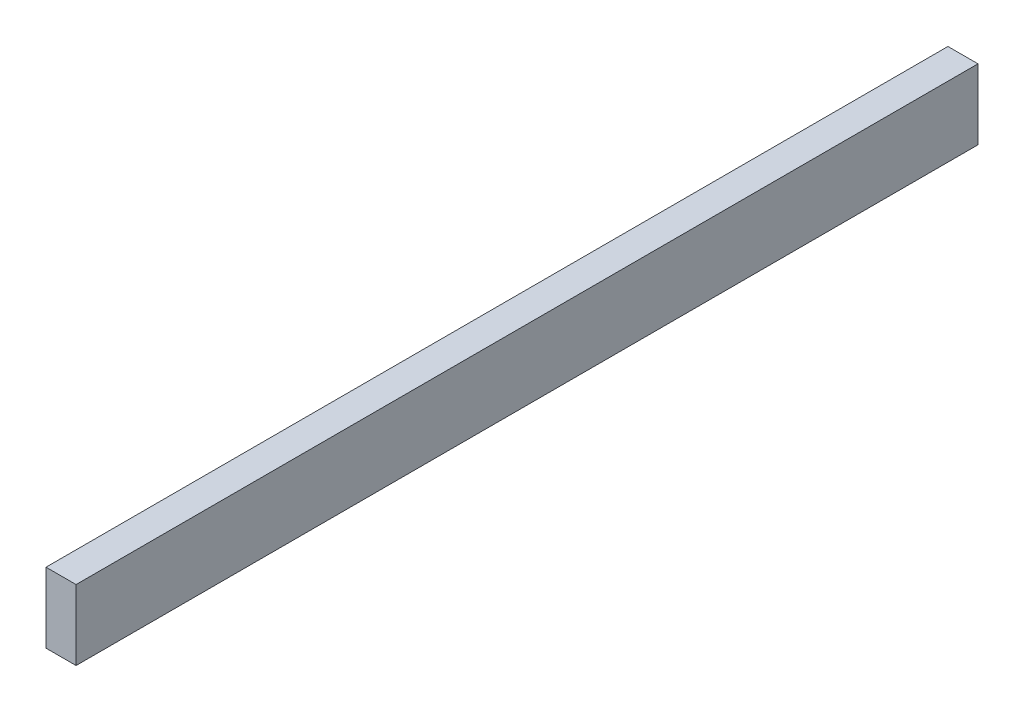
ISO-10303-21;
HEADER;
FILE_DESCRIPTION(('STEP AP214'),'2;1');
FILE_NAME('part.step','',(''),(''),'','','');
FILE_SCHEMA(('AUTOMOTIVE_DESIGN { 1 0 10303 214 1 1 1 1 }'));
ENDSEC;
DATA;
#1=APPLICATION_CONTEXT('core data for automotive mechanical design processes');
#2=APPLICATION_PROTOCOL_DEFINITION('international standard','automotive_design',2000,#1);
#3=PRODUCT_CONTEXT('',#1,'mechanical');
#4=PRODUCT('Part','Part','',(#3));
#5=PRODUCT_RELATED_PRODUCT_CATEGORY('part','',(#4));
#6=PRODUCT_DEFINITION_FORMATION('','',#4);
#7=PRODUCT_DEFINITION_CONTEXT('part definition',#1,'design');
#8=PRODUCT_DEFINITION('design','',#6,#7);
#9=PRODUCT_DEFINITION_SHAPE('','',#8);
#10=(LENGTH_UNIT() NAMED_UNIT(*) SI_UNIT(.MILLI.,.METRE.));
#11=(NAMED_UNIT(*) PLANE_ANGLE_UNIT() SI_UNIT($,.RADIAN.));
#12=(NAMED_UNIT(*) SI_UNIT($,.STERADIAN.) SOLID_ANGLE_UNIT());
#13=UNCERTAINTY_MEASURE_WITH_UNIT(LENGTH_MEASURE(1.E-05),#10,'distance_accuracy_value','');
#14=(GEOMETRIC_REPRESENTATION_CONTEXT(3) GLOBAL_UNCERTAINTY_ASSIGNED_CONTEXT((#13)) GLOBAL_UNIT_ASSIGNED_CONTEXT((#10,
#11,#12)) REPRESENTATION_CONTEXT('',''));
#15=CARTESIAN_POINT('',(0.,0.,0.));
#16=DIRECTION('',(0.,0.,1.));
#17=DIRECTION('',(1.,0.,0.));
#18=AXIS2_PLACEMENT_3D('',#15,#16,#17);
#19=CARTESIAN_POINT('',(-19.05,44.45,571.5));
#20=DIRECTION('',(1.,0.,0.));
#21=DIRECTION('',(0.,1.,0.));
#22=AXIS2_PLACEMENT_3D('',#19,#20,#21);
#23=PLANE('',#22);
#24=DIRECTION('',(0.,-1.,0.));
#25=VECTOR('',#24,1.);
#26=CARTESIAN_POINT('',(-19.05,44.45,-571.5));
#27=LINE('',#26,#25);
#28=CARTESIAN_POINT('',(-19.05,44.45,-571.5));
#29=VERTEX_POINT('',#28);
#30=CARTESIAN_POINT('',(-19.05,-44.45,-571.5));
#31=VERTEX_POINT('',#30);
#32=EDGE_CURVE('E96',#29,#31,#27,.T.);
#33=ORIENTED_EDGE('',*,*,#32,.T.);
#34=DIRECTION('',(0.,0.,-1.));
#35=VECTOR('',#34,1.);
#36=CARTESIAN_POINT('',(-19.05,-44.45,571.5));
#37=LINE('',#36,#35);
#38=CARTESIAN_POINT('',(-19.05,-44.45,571.5));
#39=VERTEX_POINT('',#38);
#40=EDGE_CURVE('E11',#39,#31,#37,.T.);
#41=ORIENTED_EDGE('',*,*,#40,.F.);
#42=DIRECTION('',(0.,-1.,0.));
#43=VECTOR('',#42,1.);
#44=CARTESIAN_POINT('',(-19.05,44.45,571.5));
#45=LINE('',#44,#43);
#46=CARTESIAN_POINT('',(-19.05,44.45,571.5));
#47=VERTEX_POINT('',#46);
#48=EDGE_CURVE('E84',#47,#39,#45,.T.);
#49=ORIENTED_EDGE('',*,*,#48,.F.);
#50=DIRECTION('',(0.,0.,-1.));
#51=VECTOR('',#50,1.);
#52=CARTESIAN_POINT('',(-19.05,44.45,571.5));
#53=LINE('',#52,#51);
#54=EDGE_CURVE('E92',#47,#29,#53,.T.);
#55=ORIENTED_EDGE('',*,*,#54,.T.);
#56=EDGE_LOOP('',(#33,#41,#49,#55));
#57=FACE_BOUND('',#56,.T.);
#58=ADVANCED_FACE('F33',(#57),#23,.F.);
#59=CARTESIAN_POINT('',(-19.05,-44.45,571.5));
#60=DIRECTION('',(0.,1.,0.));
#61=DIRECTION('',(0.,0.,1.));
#62=AXIS2_PLACEMENT_3D('',#59,#60,#61);
#63=PLANE('',#62);
#64=DIRECTION('',(1.,0.,0.));
#65=VECTOR('',#64,1.);
#66=CARTESIAN_POINT('',(-19.05,-44.45,-571.5));
#67=LINE('',#66,#65);
#68=CARTESIAN_POINT('',(19.05,-44.45,-571.5));
#69=VERTEX_POINT('',#68);
#70=EDGE_CURVE('E88',#31,#69,#67,.T.);
#71=ORIENTED_EDGE('',*,*,#70,.T.);
#72=DIRECTION('',(0.,0.,-1.));
#73=VECTOR('',#72,1.);
#74=CARTESIAN_POINT('',(19.05,-44.45,571.5));
#75=LINE('',#74,#73);
#76=CARTESIAN_POINT('',(19.05,-44.45,571.5));
#77=VERTEX_POINT('',#76);
#78=EDGE_CURVE('E41',#77,#69,#75,.T.);
#79=ORIENTED_EDGE('',*,*,#78,.F.);
#80=DIRECTION('',(1.,0.,0.));
#81=VECTOR('',#80,1.);
#82=CARTESIAN_POINT('',(-19.05,-44.45,571.5));
#83=LINE('',#82,#81);
#84=EDGE_CURVE('E79',#39,#77,#83,.T.);
#85=ORIENTED_EDGE('',*,*,#84,.F.);
#86=ORIENTED_EDGE('',*,*,#40,.T.);
#87=EDGE_LOOP('',(#71,#79,#85,#86));
#88=FACE_BOUND('',#87,.T.);
#89=ADVANCED_FACE('F87',(#88),#63,.F.);
#90=CARTESIAN_POINT('',(19.05,44.45,571.5));
#91=DIRECTION('',(-1.,0.,0.));
#92=DIRECTION('',(0.,-1.,0.));
#93=AXIS2_PLACEMENT_3D('',#90,#91,#92);
#94=PLANE('',#93);
#95=DIRECTION('',(0.,1.,0.));
#96=VECTOR('',#95,1.);
#97=CARTESIAN_POINT('',(19.05,44.45,-571.5));
#98=LINE('',#97,#96);
#99=CARTESIAN_POINT('',(19.05,44.45,-571.5));
#100=VERTEX_POINT('',#99);
#101=EDGE_CURVE('E66',#69,#100,#98,.T.);
#102=ORIENTED_EDGE('',*,*,#101,.T.);
#103=DIRECTION('',(0.,0.,-1.));
#104=VECTOR('',#103,1.);
#105=CARTESIAN_POINT('',(19.05,44.45,571.5));
#106=LINE('',#105,#104);
#107=CARTESIAN_POINT('',(19.05,44.45,571.5));
#108=VERTEX_POINT('',#107);
#109=EDGE_CURVE('E89',#108,#100,#106,.T.);
#110=ORIENTED_EDGE('',*,*,#109,.F.);
#111=DIRECTION('',(0.,1.,0.));
#112=VECTOR('',#111,1.);
#113=CARTESIAN_POINT('',(19.05,44.45,571.5));
#114=LINE('',#113,#112);
#115=EDGE_CURVE('E82',#77,#108,#114,.T.);
#116=ORIENTED_EDGE('',*,*,#115,.F.);
#117=ORIENTED_EDGE('',*,*,#78,.T.);
#118=EDGE_LOOP('',(#102,#110,#116,#117));
#119=FACE_BOUND('',#118,.T.);
#120=ADVANCED_FACE('F90',(#119),#94,.F.);
#121=CARTESIAN_POINT('',(-19.05,44.45,571.5));
#122=DIRECTION('',(0.,-1.,0.));
#123=DIRECTION('',(0.,0.,-1.));
#124=AXIS2_PLACEMENT_3D('',#121,#122,#123);
#125=PLANE('',#124);
#126=DIRECTION('',(-1.,0.,0.));
#127=VECTOR('',#126,1.);
#128=CARTESIAN_POINT('',(-19.05,44.45,-571.5));
#129=LINE('',#128,#127);
#130=EDGE_CURVE('E72',#100,#29,#129,.T.);
#131=ORIENTED_EDGE('',*,*,#130,.T.);
#132=ORIENTED_EDGE('',*,*,#54,.F.);
#133=DIRECTION('',(-1.,0.,0.));
#134=VECTOR('',#133,1.);
#135=CARTESIAN_POINT('',(-19.05,44.45,571.5));
#136=LINE('',#135,#134);
#137=EDGE_CURVE('E49',#108,#47,#136,.T.);
#138=ORIENTED_EDGE('',*,*,#137,.F.);
#139=ORIENTED_EDGE('',*,*,#109,.T.);
#140=EDGE_LOOP('',(#131,#132,#138,#139));
#141=FACE_BOUND('',#140,.T.);
#142=ADVANCED_FACE('F103',(#141),#125,.F.);
#143=CARTESIAN_POINT('',(-19.05,44.45,571.5));
#144=DIRECTION('',(0.,0.,1.));
#145=DIRECTION('',(1.,0.,0.));
#146=AXIS2_PLACEMENT_3D('',#143,#144,#145);
#147=PLANE('',#146);
#148=ORIENTED_EDGE('',*,*,#48,.T.);
#149=ORIENTED_EDGE('',*,*,#84,.T.);
#150=ORIENTED_EDGE('',*,*,#115,.T.);
#151=ORIENTED_EDGE('',*,*,#137,.T.);
#152=EDGE_LOOP('',(#148,#149,#150,#151));
#153=FACE_BOUND('',#152,.T.);
#154=ADVANCED_FACE('F80',(#153),#147,.T.);
#155=CARTESIAN_POINT('',(-19.05,44.45,-571.5));
#156=DIRECTION('',(0.,0.,1.));
#157=DIRECTION('',(1.,0.,0.));
#158=AXIS2_PLACEMENT_3D('',#155,#156,#157);
#159=PLANE('',#158);
#160=ORIENTED_EDGE('',*,*,#32,.F.);
#161=ORIENTED_EDGE('',*,*,#130,.F.);
#162=ORIENTED_EDGE('',*,*,#101,.F.);
#163=ORIENTED_EDGE('',*,*,#70,.F.);
#164=EDGE_LOOP('',(#160,#161,#162,#163));
#165=FACE_BOUND('',#164,.T.);
#166=ADVANCED_FACE('F106',(#165),#159,.F.);
#167=CLOSED_SHELL('',(#58,#89,#120,#142,#154,#166));
#168=MANIFOLD_SOLID_BREP('B2',#167);
#169=ADVANCED_BREP_SHAPE_REPRESENTATION('',(#18,#168),#14);
#170=SHAPE_DEFINITION_REPRESENTATION(#9,#169);
ENDSEC;
END-ISO-10303-21;
